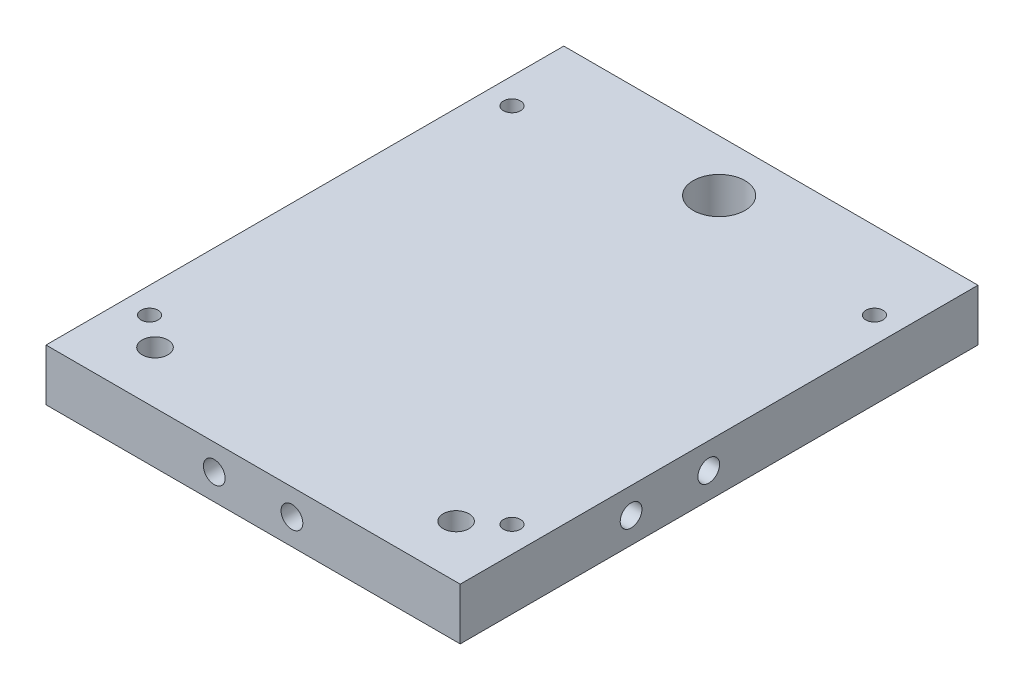
ISO-10303-21;
HEADER;
FILE_DESCRIPTION(('STEP AP214'),'2;1');
FILE_NAME('part.step','',(''),(''),'','','');
FILE_SCHEMA(('AUTOMOTIVE_DESIGN { 1 0 10303 214 1 1 1 1 }'));
ENDSEC;
DATA;
#1=APPLICATION_CONTEXT('core data for automotive mechanical design processes');
#2=APPLICATION_PROTOCOL_DEFINITION('international standard','automotive_design',2000,#1);
#3=PRODUCT_CONTEXT('',#1,'mechanical');
#4=PRODUCT('Part','Part','',(#3));
#5=PRODUCT_RELATED_PRODUCT_CATEGORY('part','',(#4));
#6=PRODUCT_DEFINITION_FORMATION('','',#4);
#7=PRODUCT_DEFINITION_CONTEXT('part definition',#1,'design');
#8=PRODUCT_DEFINITION('design','',#6,#7);
#9=PRODUCT_DEFINITION_SHAPE('','',#8);
#10=(LENGTH_UNIT() NAMED_UNIT(*) SI_UNIT(.MILLI.,.METRE.));
#11=(NAMED_UNIT(*) PLANE_ANGLE_UNIT() SI_UNIT($,.RADIAN.));
#12=(NAMED_UNIT(*) SI_UNIT($,.STERADIAN.) SOLID_ANGLE_UNIT());
#13=UNCERTAINTY_MEASURE_WITH_UNIT(LENGTH_MEASURE(1.E-05),#10,'distance_accuracy_value','');
#14=(GEOMETRIC_REPRESENTATION_CONTEXT(3) GLOBAL_UNCERTAINTY_ASSIGNED_CONTEXT((#13)) GLOBAL_UNIT_ASSIGNED_CONTEXT((#10,
#11,#12)) REPRESENTATION_CONTEXT('',''));
#15=CARTESIAN_POINT('',(0.,0.,0.));
#16=DIRECTION('',(0.,0.,1.));
#17=DIRECTION('',(1.,0.,0.));
#18=AXIS2_PLACEMENT_3D('',#15,#16,#17);
#19=CARTESIAN_POINT('',(0.,10.,0.));
#20=DIRECTION('',(0.,-1.,0.));
#21=DIRECTION('',(0.,0.,-1.));
#22=AXIS2_PLACEMENT_3D('',#19,#20,#21);
#23=PLANE('',#22);
#24=CARTESIAN_POINT('',(-29.0717121826819,10.,39.8738727668022));
#25=DIRECTION('',(0.,1.,0.));
#26=DIRECTION('',(0.,0.,1.));
#27=AXIS2_PLACEMENT_3D('',#24,#25,#26);
#28=CIRCLE('',#27,2.49999999999999);
#29=CARTESIAN_POINT('',(-29.0717121826819,10.,42.3738727668022));
#30=VERTEX_POINT('',#29);
#31=EDGE_CURVE('E152',#30,#30,#28,.T.);
#32=ORIENTED_EDGE('',*,*,#31,.F.);
#33=EDGE_LOOP('',(#32));
#34=FACE_BOUND('',#33,.T.);
#35=DIRECTION('',(0.,0.,-1.));
#36=VECTOR('',#35,1.);
#37=CARTESIAN_POINT('',(40.,10.,50.));
#38=LINE('',#37,#36);
#39=CARTESIAN_POINT('',(40.,10.,50.));
#40=VERTEX_POINT('',#39);
#41=CARTESIAN_POINT('',(40.,10.,-50.));
#42=VERTEX_POINT('',#41);
#43=EDGE_CURVE('E195',#40,#42,#38,.T.);
#44=ORIENTED_EDGE('',*,*,#43,.T.);
#45=DIRECTION('',(-1.,0.,0.));
#46=VECTOR('',#45,1.);
#47=CARTESIAN_POINT('',(-40.,10.,-50.));
#48=LINE('',#47,#46);
#49=CARTESIAN_POINT('',(-40.,10.,-50.));
#50=VERTEX_POINT('',#49);
#51=EDGE_CURVE('E88',#42,#50,#48,.T.);
#52=ORIENTED_EDGE('',*,*,#51,.T.);
#53=DIRECTION('',(0.,0.,1.));
#54=VECTOR('',#53,1.);
#55=CARTESIAN_POINT('',(-40.,10.,50.));
#56=LINE('',#55,#54);
#57=CARTESIAN_POINT('',(-40.,10.,50.));
#58=VERTEX_POINT('',#57);
#59=EDGE_CURVE('E198',#50,#58,#56,.T.);
#60=ORIENTED_EDGE('',*,*,#59,.T.);
#61=DIRECTION('',(1.,0.,0.));
#62=VECTOR('',#61,1.);
#63=CARTESIAN_POINT('',(-40.,10.,50.));
#64=LINE('',#63,#62);
#65=EDGE_CURVE('E57',#58,#40,#64,.T.);
#66=ORIENTED_EDGE('',*,*,#65,.T.);
#67=EDGE_LOOP('',(#44,#52,#60,#66));
#68=FACE_BOUND('',#67,.T.);
#69=CARTESIAN_POINT('',(0.,10.,-40.));
#70=DIRECTION('',(0.,1.,0.));
#71=DIRECTION('',(0.,0.,1.));
#72=AXIS2_PLACEMENT_3D('',#69,#70,#71);
#73=CIRCLE('',#72,5.00000000000001);
#74=CARTESIAN_POINT('',(0.,10.,-35.));
#75=VERTEX_POINT('',#74);
#76=EDGE_CURVE('E188',#75,#75,#73,.T.);
#77=ORIENTED_EDGE('',*,*,#76,.F.);
#78=EDGE_LOOP('',(#77));
#79=FACE_BOUND('',#78,.T.);
#80=CARTESIAN_POINT('',(-35.,10.,-35.));
#81=DIRECTION('',(0.,-1.,0.));
#82=DIRECTION('',(0.,0.,-1.));
#83=AXIS2_PLACEMENT_3D('',#80,#81,#82);
#84=CIRCLE('',#83,1.65);
#85=CARTESIAN_POINT('',(-35.,10.,-36.65));
#86=VERTEX_POINT('',#85);
#87=EDGE_CURVE('E185',#86,#86,#84,.T.);
#88=ORIENTED_EDGE('',*,*,#87,.T.);
#89=EDGE_LOOP('',(#88));
#90=FACE_BOUND('',#89,.T.);
#91=CARTESIAN_POINT('',(35.,10.,-35.));
#92=DIRECTION('',(0.,-1.,0.));
#93=DIRECTION('',(0.,0.,-1.));
#94=AXIS2_PLACEMENT_3D('',#91,#92,#93);
#95=CIRCLE('',#94,1.65);
#96=CARTESIAN_POINT('',(35.,10.,-36.65));
#97=VERTEX_POINT('',#96);
#98=EDGE_CURVE('E179',#97,#97,#95,.T.);
#99=ORIENTED_EDGE('',*,*,#98,.T.);
#100=EDGE_LOOP('',(#99));
#101=FACE_BOUND('',#100,.T.);
#102=CARTESIAN_POINT('',(35.,10.,35.));
#103=DIRECTION('',(0.,-1.,0.));
#104=DIRECTION('',(0.,0.,-1.));
#105=AXIS2_PLACEMENT_3D('',#102,#103,#104);
#106=CIRCLE('',#105,1.65);
#107=CARTESIAN_POINT('',(35.,10.,33.35));
#108=VERTEX_POINT('',#107);
#109=EDGE_CURVE('E173',#108,#108,#106,.T.);
#110=ORIENTED_EDGE('',*,*,#109,.T.);
#111=EDGE_LOOP('',(#110));
#112=FACE_BOUND('',#111,.T.);
#113=CARTESIAN_POINT('',(-35.,10.,35.));
#114=DIRECTION('',(0.,-1.,0.));
#115=DIRECTION('',(0.,0.,-1.));
#116=AXIS2_PLACEMENT_3D('',#113,#114,#115);
#117=CIRCLE('',#116,1.65);
#118=CARTESIAN_POINT('',(-35.,10.,33.35));
#119=VERTEX_POINT('',#118);
#120=EDGE_CURVE('E167',#119,#119,#117,.T.);
#121=ORIENTED_EDGE('',*,*,#120,.T.);
#122=EDGE_LOOP('',(#121));
#123=FACE_BOUND('',#122,.T.);
#124=CARTESIAN_POINT('',(29.0717121826819,10.,39.8738727668022));
#125=DIRECTION('',(0.,1.,0.));
#126=DIRECTION('',(0.,0.,1.));
#127=AXIS2_PLACEMENT_3D('',#124,#125,#126);
#128=CIRCLE('',#127,2.49999999999999);
#129=CARTESIAN_POINT('',(29.0717121826819,10.,42.3738727668022));
#130=VERTEX_POINT('',#129);
#131=EDGE_CURVE('E158',#130,#130,#128,.T.);
#132=ORIENTED_EDGE('',*,*,#131,.F.);
#133=EDGE_LOOP('',(#132));
#134=FACE_BOUND('',#133,.T.);
#135=ADVANCED_FACE('F40',(#34,#68,#79,#90,#101,#112,#123,#134),#23,.F.);
#136=CARTESIAN_POINT('',(40.,10.,50.));
#137=DIRECTION('',(-1.,0.,0.));
#138=DIRECTION('',(0.,0.,1.));
#139=AXIS2_PLACEMENT_3D('',#136,#137,#138);
#140=PLANE('',#139);
#141=CARTESIAN_POINT('',(40.,5.,17.));
#142=DIRECTION('',(1.,0.,0.));
#143=DIRECTION('',(0.,0.,-1.));
#144=AXIS2_PLACEMENT_3D('',#141,#142,#143);
#145=CIRCLE('',#144,2.09999999999999);
#146=CARTESIAN_POINT('',(40.,5.,14.9));
#147=VERTEX_POINT('',#146);
#148=EDGE_CURVE('E140',#147,#147,#145,.T.);
#149=ORIENTED_EDGE('',*,*,#148,.F.);
#150=EDGE_LOOP('',(#149));
#151=FACE_BOUND('',#150,.T.);
#152=CARTESIAN_POINT('',(40.,5.,1.99999999999999));
#153=DIRECTION('',(1.,0.,0.));
#154=DIRECTION('',(0.,0.,-1.));
#155=AXIS2_PLACEMENT_3D('',#152,#153,#154);
#156=CIRCLE('',#155,2.09999999999999);
#157=CARTESIAN_POINT('',(40.,5.,-0.0999999999999942));
#158=VERTEX_POINT('',#157);
#159=EDGE_CURVE('E146',#158,#158,#156,.T.);
#160=ORIENTED_EDGE('',*,*,#159,.F.);
#161=EDGE_LOOP('',(#160));
#162=FACE_BOUND('',#161,.T.);
#163=DIRECTION('',(0.,0.,-1.));
#164=VECTOR('',#163,1.);
#165=CARTESIAN_POINT('',(40.,0.,50.));
#166=LINE('',#165,#164);
#167=CARTESIAN_POINT('',(40.,0.,50.));
#168=VERTEX_POINT('',#167);
#169=CARTESIAN_POINT('',(40.,0.,-50.));
#170=VERTEX_POINT('',#169);
#171=EDGE_CURVE('E194',#168,#170,#166,.T.);
#172=ORIENTED_EDGE('',*,*,#171,.T.);
#173=DIRECTION('',(0.,-1.,0.));
#174=VECTOR('',#173,1.);
#175=CARTESIAN_POINT('',(40.,10.,-50.));
#176=LINE('',#175,#174);
#177=EDGE_CURVE('E11',#42,#170,#176,.T.);
#178=ORIENTED_EDGE('',*,*,#177,.F.);
#179=ORIENTED_EDGE('',*,*,#43,.F.);
#180=DIRECTION('',(0.,-1.,0.));
#181=VECTOR('',#180,1.);
#182=CARTESIAN_POINT('',(40.,10.,50.));
#183=LINE('',#182,#181);
#184=EDGE_CURVE('E201',#40,#168,#183,.T.);
#185=ORIENTED_EDGE('',*,*,#184,.T.);
#186=EDGE_LOOP('',(#172,#178,#179,#185));
#187=FACE_BOUND('',#186,.T.);
#188=ADVANCED_FACE('F42',(#151,#162,#187),#140,.F.);
#189=CARTESIAN_POINT('',(-40.,10.,-50.));
#190=DIRECTION('',(0.,0.,1.));
#191=DIRECTION('',(1.,0.,0.));
#192=AXIS2_PLACEMENT_3D('',#189,#190,#191);
#193=PLANE('',#192);
#194=DIRECTION('',(-1.,0.,0.));
#195=VECTOR('',#194,1.);
#196=CARTESIAN_POINT('',(-40.,0.,-50.));
#197=LINE('',#196,#195);
#198=CARTESIAN_POINT('',(-40.,0.,-50.));
#199=VERTEX_POINT('',#198);
#200=EDGE_CURVE('E204',#170,#199,#197,.T.);
#201=ORIENTED_EDGE('',*,*,#200,.T.);
#202=DIRECTION('',(0.,-1.,0.));
#203=VECTOR('',#202,1.);
#204=CARTESIAN_POINT('',(-40.,10.,-50.));
#205=LINE('',#204,#203);
#206=EDGE_CURVE('E49',#50,#199,#205,.T.);
#207=ORIENTED_EDGE('',*,*,#206,.F.);
#208=ORIENTED_EDGE('',*,*,#51,.F.);
#209=ORIENTED_EDGE('',*,*,#177,.T.);
#210=EDGE_LOOP('',(#201,#207,#208,#209));
#211=FACE_BOUND('',#210,.T.);
#212=ADVANCED_FACE('F230',(#211),#193,.F.);
#213=CARTESIAN_POINT('',(-40.,10.,50.));
#214=DIRECTION('',(1.,0.,0.));
#215=DIRECTION('',(0.,0.,-1.));
#216=AXIS2_PLACEMENT_3D('',#213,#214,#215);
#217=PLANE('',#216);
#218=CARTESIAN_POINT('',(-40.,5.,5.));
#219=DIRECTION('',(-1.,0.,0.));
#220=DIRECTION('',(0.,0.,1.));
#221=AXIS2_PLACEMENT_3D('',#218,#219,#220);
#222=CIRCLE('',#221,2.09999999999999);
#223=CARTESIAN_POINT('',(-40.,5.,7.09999999999999));
#224=VERTEX_POINT('',#223);
#225=EDGE_CURVE('E128',#224,#224,#222,.T.);
#226=ORIENTED_EDGE('',*,*,#225,.F.);
#227=EDGE_LOOP('',(#226));
#228=FACE_BOUND('',#227,.T.);
#229=CARTESIAN_POINT('',(-40.,5.,-8.));
#230=DIRECTION('',(-1.,0.,0.));
#231=DIRECTION('',(0.,0.,1.));
#232=AXIS2_PLACEMENT_3D('',#229,#230,#231);
#233=CIRCLE('',#232,2.09999999999999);
#234=CARTESIAN_POINT('',(-40.,5.,-5.90000000000001));
#235=VERTEX_POINT('',#234);
#236=EDGE_CURVE('E134',#235,#235,#233,.T.);
#237=ORIENTED_EDGE('',*,*,#236,.F.);
#238=EDGE_LOOP('',(#237));
#239=FACE_BOUND('',#238,.T.);
#240=DIRECTION('',(0.,0.,1.));
#241=VECTOR('',#240,1.);
#242=CARTESIAN_POINT('',(-40.,0.,50.));
#243=LINE('',#242,#241);
#244=CARTESIAN_POINT('',(-40.,0.,50.));
#245=VERTEX_POINT('',#244);
#246=EDGE_CURVE('E75',#199,#245,#243,.T.);
#247=ORIENTED_EDGE('',*,*,#246,.T.);
#248=DIRECTION('',(0.,-1.,0.));
#249=VECTOR('',#248,1.);
#250=CARTESIAN_POINT('',(-40.,10.,50.));
#251=LINE('',#250,#249);
#252=EDGE_CURVE('E210',#58,#245,#251,.T.);
#253=ORIENTED_EDGE('',*,*,#252,.F.);
#254=ORIENTED_EDGE('',*,*,#59,.F.);
#255=ORIENTED_EDGE('',*,*,#206,.T.);
#256=EDGE_LOOP('',(#247,#253,#254,#255));
#257=FACE_BOUND('',#256,.T.);
#258=ADVANCED_FACE('F212',(#228,#239,#257),#217,.F.);
#259=CARTESIAN_POINT('',(-40.,10.,50.));
#260=DIRECTION('',(0.,0.,-1.));
#261=DIRECTION('',(-1.,0.,0.));
#262=AXIS2_PLACEMENT_3D('',#259,#260,#261);
#263=PLANE('',#262);
#264=CARTESIAN_POINT('',(-7.5,5.,50.));
#265=DIRECTION('',(0.,0.,1.));
#266=DIRECTION('',(1.,0.,0.));
#267=AXIS2_PLACEMENT_3D('',#264,#265,#266);
#268=CIRCLE('',#267,2.09999999999999);
#269=CARTESIAN_POINT('',(-5.40000000000001,5.,50.));
#270=VERTEX_POINT('',#269);
#271=EDGE_CURVE('E118',#270,#270,#268,.T.);
#272=ORIENTED_EDGE('',*,*,#271,.F.);
#273=EDGE_LOOP('',(#272));
#274=FACE_BOUND('',#273,.T.);
#275=CARTESIAN_POINT('',(7.5,5.,50.));
#276=DIRECTION('',(0.,0.,1.));
#277=DIRECTION('',(1.,0.,0.));
#278=AXIS2_PLACEMENT_3D('',#275,#276,#277);
#279=CIRCLE('',#278,2.09999999999999);
#280=CARTESIAN_POINT('',(9.59999999999999,5.,50.));
#281=VERTEX_POINT('',#280);
#282=EDGE_CURVE('E117',#281,#281,#279,.T.);
#283=ORIENTED_EDGE('',*,*,#282,.F.);
#284=EDGE_LOOP('',(#283));
#285=FACE_BOUND('',#284,.T.);
#286=DIRECTION('',(1.,0.,0.));
#287=VECTOR('',#286,1.);
#288=CARTESIAN_POINT('',(-40.,0.,50.));
#289=LINE('',#288,#287);
#290=EDGE_CURVE('E81',#245,#168,#289,.T.);
#291=ORIENTED_EDGE('',*,*,#290,.T.);
#292=ORIENTED_EDGE('',*,*,#184,.F.);
#293=ORIENTED_EDGE('',*,*,#65,.F.);
#294=ORIENTED_EDGE('',*,*,#252,.T.);
#295=EDGE_LOOP('',(#291,#292,#293,#294));
#296=FACE_BOUND('',#295,.T.);
#297=ADVANCED_FACE('F219',(#274,#285,#296),#263,.F.);
#298=CARTESIAN_POINT('',(0.,0.,0.));
#299=DIRECTION('',(0.,-1.,0.));
#300=DIRECTION('',(0.,0.,-1.));
#301=AXIS2_PLACEMENT_3D('',#298,#299,#300);
#302=PLANE('',#301);
#303=CARTESIAN_POINT('',(-29.0717121826819,0.,39.8738727668022));
#304=DIRECTION('',(0.,1.,0.));
#305=DIRECTION('',(0.,0.,1.));
#306=AXIS2_PLACEMENT_3D('',#303,#304,#305);
#307=CIRCLE('',#306,2.5);
#308=CARTESIAN_POINT('',(-29.0717121826819,0.,42.3738727668022));
#309=VERTEX_POINT('',#308);
#310=EDGE_CURVE('E155',#309,#309,#307,.T.);
#311=ORIENTED_EDGE('',*,*,#310,.T.);
#312=EDGE_LOOP('',(#311));
#313=FACE_BOUND('',#312,.T.);
#314=CARTESIAN_POINT('',(29.0717121826819,0.,39.8738727668022));
#315=DIRECTION('',(0.,1.,0.));
#316=DIRECTION('',(0.,0.,1.));
#317=AXIS2_PLACEMENT_3D('',#314,#315,#316);
#318=CIRCLE('',#317,2.5);
#319=CARTESIAN_POINT('',(29.0717121826819,0.,42.3738727668022));
#320=VERTEX_POINT('',#319);
#321=EDGE_CURVE('E161',#320,#320,#318,.T.);
#322=ORIENTED_EDGE('',*,*,#321,.T.);
#323=EDGE_LOOP('',(#322));
#324=FACE_BOUND('',#323,.T.);
#325=CARTESIAN_POINT('',(-35.,0.,35.));
#326=DIRECTION('',(0.,-1.,0.));
#327=DIRECTION('',(0.,0.,-1.));
#328=AXIS2_PLACEMENT_3D('',#325,#326,#327);
#329=CIRCLE('',#328,1.64999999999998);
#330=CARTESIAN_POINT('',(-35.,0.,33.35));
#331=VERTEX_POINT('',#330);
#332=EDGE_CURVE('E164',#331,#331,#329,.T.);
#333=ORIENTED_EDGE('',*,*,#332,.F.);
#334=EDGE_LOOP('',(#333));
#335=FACE_BOUND('',#334,.T.);
#336=CARTESIAN_POINT('',(35.,0.,35.));
#337=DIRECTION('',(0.,-1.,0.));
#338=DIRECTION('',(0.,0.,-1.));
#339=AXIS2_PLACEMENT_3D('',#336,#337,#338);
#340=CIRCLE('',#339,1.64999999999998);
#341=CARTESIAN_POINT('',(35.,0.,33.35));
#342=VERTEX_POINT('',#341);
#343=EDGE_CURVE('E170',#342,#342,#340,.T.);
#344=ORIENTED_EDGE('',*,*,#343,.F.);
#345=EDGE_LOOP('',(#344));
#346=FACE_BOUND('',#345,.T.);
#347=CARTESIAN_POINT('',(35.,0.,-35.));
#348=DIRECTION('',(0.,-1.,0.));
#349=DIRECTION('',(0.,0.,-1.));
#350=AXIS2_PLACEMENT_3D('',#347,#348,#349);
#351=CIRCLE('',#350,1.64999999999998);
#352=CARTESIAN_POINT('',(35.,0.,-36.65));
#353=VERTEX_POINT('',#352);
#354=EDGE_CURVE('E176',#353,#353,#351,.T.);
#355=ORIENTED_EDGE('',*,*,#354,.F.);
#356=EDGE_LOOP('',(#355));
#357=FACE_BOUND('',#356,.T.);
#358=CARTESIAN_POINT('',(-35.,0.,-35.));
#359=DIRECTION('',(0.,-1.,0.));
#360=DIRECTION('',(0.,0.,-1.));
#361=AXIS2_PLACEMENT_3D('',#358,#359,#360);
#362=CIRCLE('',#361,1.64999999999998);
#363=CARTESIAN_POINT('',(-35.,0.,-36.65));
#364=VERTEX_POINT('',#363);
#365=EDGE_CURVE('E182',#364,#364,#362,.T.);
#366=ORIENTED_EDGE('',*,*,#365,.F.);
#367=EDGE_LOOP('',(#366));
#368=FACE_BOUND('',#367,.T.);
#369=CARTESIAN_POINT('',(0.,0.,-40.));
#370=DIRECTION('',(0.,1.,0.));
#371=DIRECTION('',(0.,0.,1.));
#372=AXIS2_PLACEMENT_3D('',#369,#370,#371);
#373=CIRCLE('',#372,5.00000000000001);
#374=CARTESIAN_POINT('',(0.,0.,-35.));
#375=VERTEX_POINT('',#374);
#376=EDGE_CURVE('E191',#375,#375,#373,.T.);
#377=ORIENTED_EDGE('',*,*,#376,.T.);
#378=EDGE_LOOP('',(#377));
#379=FACE_BOUND('',#378,.T.);
#380=ORIENTED_EDGE('',*,*,#171,.F.);
#381=ORIENTED_EDGE('',*,*,#290,.F.);
#382=ORIENTED_EDGE('',*,*,#246,.F.);
#383=ORIENTED_EDGE('',*,*,#200,.F.);
#384=EDGE_LOOP('',(#380,#381,#382,#383));
#385=FACE_BOUND('',#384,.T.);
#386=ADVANCED_FACE('F215',(#313,#324,#335,#346,#357,#368,#379,#385),#302,.T.);
#387=CARTESIAN_POINT('',(0.,10.,-40.));
#388=DIRECTION('',(0.,1.,0.));
#389=DIRECTION('',(0.,0.,1.));
#390=AXIS2_PLACEMENT_3D('',#387,#388,#389);
#391=CYLINDRICAL_SURFACE('',#390,5.00000000000001);
#392=ORIENTED_EDGE('',*,*,#376,.F.);
#393=EDGE_LOOP('',(#392));
#394=FACE_BOUND('',#393,.T.);
#395=ORIENTED_EDGE('',*,*,#76,.T.);
#396=EDGE_LOOP('',(#395));
#397=FACE_BOUND('',#396,.T.);
#398=ADVANCED_FACE('F227',(#394,#397),#391,.F.);
#399=CARTESIAN_POINT('',(-35.,0.,-35.));
#400=DIRECTION('',(0.,-1.,0.));
#401=DIRECTION('',(0.,0.,-1.));
#402=AXIS2_PLACEMENT_3D('',#399,#400,#401);
#403=CYLINDRICAL_SURFACE('',#402,1.64999999999999);
#404=ORIENTED_EDGE('',*,*,#87,.F.);
#405=EDGE_LOOP('',(#404));
#406=FACE_BOUND('',#405,.T.);
#407=ORIENTED_EDGE('',*,*,#365,.T.);
#408=EDGE_LOOP('',(#407));
#409=FACE_BOUND('',#408,.T.);
#410=ADVANCED_FACE('F246',(#406,#409),#403,.F.);
#411=CARTESIAN_POINT('',(35.,0.,-35.));
#412=DIRECTION('',(0.,-1.,0.));
#413=DIRECTION('',(0.,0.,-1.));
#414=AXIS2_PLACEMENT_3D('',#411,#412,#413);
#415=CYLINDRICAL_SURFACE('',#414,1.64999999999999);
#416=ORIENTED_EDGE('',*,*,#98,.F.);
#417=EDGE_LOOP('',(#416));
#418=FACE_BOUND('',#417,.T.);
#419=ORIENTED_EDGE('',*,*,#354,.T.);
#420=EDGE_LOOP('',(#419));
#421=FACE_BOUND('',#420,.T.);
#422=ADVANCED_FACE('F250',(#418,#421),#415,.F.);
#423=CARTESIAN_POINT('',(35.,0.,35.));
#424=DIRECTION('',(0.,-1.,0.));
#425=DIRECTION('',(0.,0.,-1.));
#426=AXIS2_PLACEMENT_3D('',#423,#424,#425);
#427=CYLINDRICAL_SURFACE('',#426,1.64999999999999);
#428=ORIENTED_EDGE('',*,*,#109,.F.);
#429=EDGE_LOOP('',(#428));
#430=FACE_BOUND('',#429,.T.);
#431=ORIENTED_EDGE('',*,*,#343,.T.);
#432=EDGE_LOOP('',(#431));
#433=FACE_BOUND('',#432,.T.);
#434=ADVANCED_FACE('F254',(#430,#433),#427,.F.);
#435=CARTESIAN_POINT('',(-35.,0.,35.));
#436=DIRECTION('',(0.,-1.,0.));
#437=DIRECTION('',(0.,0.,-1.));
#438=AXIS2_PLACEMENT_3D('',#435,#436,#437);
#439=CYLINDRICAL_SURFACE('',#438,1.64999999999999);
#440=ORIENTED_EDGE('',*,*,#120,.F.);
#441=EDGE_LOOP('',(#440));
#442=FACE_BOUND('',#441,.T.);
#443=ORIENTED_EDGE('',*,*,#332,.T.);
#444=EDGE_LOOP('',(#443));
#445=FACE_BOUND('',#444,.T.);
#446=ADVANCED_FACE('F258',(#442,#445),#439,.F.);
#447=CARTESIAN_POINT('',(29.0717121826819,10.,39.8738727668022));
#448=DIRECTION('',(0.,1.,0.));
#449=DIRECTION('',(0.,0.,1.));
#450=AXIS2_PLACEMENT_3D('',#447,#448,#449);
#451=CYLINDRICAL_SURFACE('',#450,2.5);
#452=ORIENTED_EDGE('',*,*,#321,.F.);
#453=EDGE_LOOP('',(#452));
#454=FACE_BOUND('',#453,.T.);
#455=ORIENTED_EDGE('',*,*,#131,.T.);
#456=EDGE_LOOP('',(#455));
#457=FACE_BOUND('',#456,.T.);
#458=ADVANCED_FACE('F262',(#454,#457),#451,.F.);
#459=CARTESIAN_POINT('',(-29.0717121826819,10.,39.8738727668022));
#460=DIRECTION('',(0.,1.,0.));
#461=DIRECTION('',(0.,0.,1.));
#462=AXIS2_PLACEMENT_3D('',#459,#460,#461);
#463=CYLINDRICAL_SURFACE('',#462,2.49999999999999);
#464=ORIENTED_EDGE('',*,*,#310,.F.);
#465=EDGE_LOOP('',(#464));
#466=FACE_BOUND('',#465,.T.);
#467=ORIENTED_EDGE('',*,*,#31,.T.);
#468=EDGE_LOOP('',(#467));
#469=FACE_BOUND('',#468,.T.);
#470=ADVANCED_FACE('F266',(#466,#469),#463,.F.);
#471=CARTESIAN_POINT('',(27.6,5.,1.99999999999999));
#472=DIRECTION('',(1.,0.,0.));
#473=DIRECTION('',(0.,0.,-1.));
#474=AXIS2_PLACEMENT_3D('',#471,#472,#473);
#475=CONICAL_SURFACE('',#474,2.09999999999999,1.02974425867665);
#476=CARTESIAN_POINT('',(26.3381927000421,5.,1.99999999999999));
#477=VERTEX_POINT('',#476);
#478=VERTEX_LOOP('',#477);
#479=FACE_BOUND('',#478,.T.);
#480=CARTESIAN_POINT('',(27.6,5.,1.99999999999999));
#481=DIRECTION('',(1.,0.,0.));
#482=DIRECTION('',(0.,0.,-1.));
#483=AXIS2_PLACEMENT_3D('',#480,#481,#482);
#484=CIRCLE('',#483,2.09999999999999);
#485=CARTESIAN_POINT('',(27.6,5.,-0.0999999999999925));
#486=VERTEX_POINT('',#485);
#487=EDGE_CURVE('E149',#486,#486,#484,.T.);
#488=ORIENTED_EDGE('',*,*,#487,.T.);
#489=EDGE_LOOP('',(#488));
#490=FACE_BOUND('',#489,.T.);
#491=ADVANCED_FACE('F270',(#479,#490),#475,.F.);
#492=CARTESIAN_POINT('',(40.,5.,1.99999999999999));
#493=DIRECTION('',(1.,0.,0.));
#494=DIRECTION('',(0.,0.,-1.));
#495=AXIS2_PLACEMENT_3D('',#492,#493,#494);
#496=CYLINDRICAL_SURFACE('',#495,2.09999999999999);
#497=ORIENTED_EDGE('',*,*,#487,.F.);
#498=EDGE_LOOP('',(#497));
#499=FACE_BOUND('',#498,.T.);
#500=ORIENTED_EDGE('',*,*,#159,.T.);
#501=EDGE_LOOP('',(#500));
#502=FACE_BOUND('',#501,.T.);
#503=ADVANCED_FACE('F274',(#499,#502),#496,.F.);
#504=CARTESIAN_POINT('',(27.6,5.,17.));
#505=DIRECTION('',(1.,0.,0.));
#506=DIRECTION('',(0.,0.,-1.));
#507=AXIS2_PLACEMENT_3D('',#504,#505,#506);
#508=CONICAL_SURFACE('',#507,2.09999999999999,1.02974425867665);
#509=CARTESIAN_POINT('',(26.3381927000421,5.,17.));
#510=VERTEX_POINT('',#509);
#511=VERTEX_LOOP('',#510);
#512=FACE_BOUND('',#511,.T.);
#513=CARTESIAN_POINT('',(27.6,5.,17.));
#514=DIRECTION('',(1.,0.,0.));
#515=DIRECTION('',(0.,0.,-1.));
#516=AXIS2_PLACEMENT_3D('',#513,#514,#515);
#517=CIRCLE('',#516,2.09999999999999);
#518=CARTESIAN_POINT('',(27.6,5.,14.9));
#519=VERTEX_POINT('',#518);
#520=EDGE_CURVE('E143',#519,#519,#517,.T.);
#521=ORIENTED_EDGE('',*,*,#520,.T.);
#522=EDGE_LOOP('',(#521));
#523=FACE_BOUND('',#522,.T.);
#524=ADVANCED_FACE('F278',(#512,#523),#508,.F.);
#525=CARTESIAN_POINT('',(40.,5.,17.));
#526=DIRECTION('',(1.,0.,0.));
#527=DIRECTION('',(0.,0.,-1.));
#528=AXIS2_PLACEMENT_3D('',#525,#526,#527);
#529=CYLINDRICAL_SURFACE('',#528,2.09999999999999);
#530=ORIENTED_EDGE('',*,*,#520,.F.);
#531=EDGE_LOOP('',(#530));
#532=FACE_BOUND('',#531,.T.);
#533=ORIENTED_EDGE('',*,*,#148,.T.);
#534=EDGE_LOOP('',(#533));
#535=FACE_BOUND('',#534,.T.);
#536=ADVANCED_FACE('F282',(#532,#535),#529,.F.);
#537=CARTESIAN_POINT('',(-27.6,5.,-8.));
#538=DIRECTION('',(-1.,0.,0.));
#539=DIRECTION('',(0.,0.,1.));
#540=AXIS2_PLACEMENT_3D('',#537,#538,#539);
#541=CONICAL_SURFACE('',#540,2.09999999999999,1.02974425867665);
#542=CARTESIAN_POINT('',(-26.3381927000421,5.,-8.));
#543=VERTEX_POINT('',#542);
#544=VERTEX_LOOP('',#543);
#545=FACE_BOUND('',#544,.T.);
#546=CARTESIAN_POINT('',(-27.6,5.,-8.));
#547=DIRECTION('',(-1.,0.,0.));
#548=DIRECTION('',(0.,0.,1.));
#549=AXIS2_PLACEMENT_3D('',#546,#547,#548);
#550=CIRCLE('',#549,2.09999999999999);
#551=CARTESIAN_POINT('',(-27.6,5.,-5.90000000000001));
#552=VERTEX_POINT('',#551);
#553=EDGE_CURVE('E137',#552,#552,#550,.T.);
#554=ORIENTED_EDGE('',*,*,#553,.T.);
#555=EDGE_LOOP('',(#554));
#556=FACE_BOUND('',#555,.T.);
#557=ADVANCED_FACE('F286',(#545,#556),#541,.F.);
#558=CARTESIAN_POINT('',(-40.,5.,-8.));
#559=DIRECTION('',(-1.,0.,0.));
#560=DIRECTION('',(0.,0.,1.));
#561=AXIS2_PLACEMENT_3D('',#558,#559,#560);
#562=CYLINDRICAL_SURFACE('',#561,2.09999999999999);
#563=ORIENTED_EDGE('',*,*,#553,.F.);
#564=EDGE_LOOP('',(#563));
#565=FACE_BOUND('',#564,.T.);
#566=ORIENTED_EDGE('',*,*,#236,.T.);
#567=EDGE_LOOP('',(#566));
#568=FACE_BOUND('',#567,.T.);
#569=ADVANCED_FACE('F290',(#565,#568),#562,.F.);
#570=CARTESIAN_POINT('',(-27.6,5.,5.));
#571=DIRECTION('',(-1.,0.,0.));
#572=DIRECTION('',(0.,0.,1.));
#573=AXIS2_PLACEMENT_3D('',#570,#571,#572);
#574=CONICAL_SURFACE('',#573,2.09999999999999,1.02974425867665);
#575=CARTESIAN_POINT('',(-26.3381927000421,5.,5.));
#576=VERTEX_POINT('',#575);
#577=VERTEX_LOOP('',#576);
#578=FACE_BOUND('',#577,.T.);
#579=CARTESIAN_POINT('',(-27.6,5.,5.));
#580=DIRECTION('',(-1.,0.,0.));
#581=DIRECTION('',(0.,0.,1.));
#582=AXIS2_PLACEMENT_3D('',#579,#580,#581);
#583=CIRCLE('',#582,2.09999999999999);
#584=CARTESIAN_POINT('',(-27.6,5.,7.09999999999998));
#585=VERTEX_POINT('',#584);
#586=EDGE_CURVE('E131',#585,#585,#583,.T.);
#587=ORIENTED_EDGE('',*,*,#586,.T.);
#588=EDGE_LOOP('',(#587));
#589=FACE_BOUND('',#588,.T.);
#590=ADVANCED_FACE('F294',(#578,#589),#574,.F.);
#591=CARTESIAN_POINT('',(-40.,5.,5.));
#592=DIRECTION('',(-1.,0.,0.));
#593=DIRECTION('',(0.,0.,1.));
#594=AXIS2_PLACEMENT_3D('',#591,#592,#593);
#595=CYLINDRICAL_SURFACE('',#594,2.09999999999999);
#596=ORIENTED_EDGE('',*,*,#586,.F.);
#597=EDGE_LOOP('',(#596));
#598=FACE_BOUND('',#597,.T.);
#599=ORIENTED_EDGE('',*,*,#225,.T.);
#600=EDGE_LOOP('',(#599));
#601=FACE_BOUND('',#600,.T.);
#602=ADVANCED_FACE('F298',(#598,#601),#595,.F.);
#603=CARTESIAN_POINT('',(7.5,5.,39.6));
#604=DIRECTION('',(0.,0.,1.));
#605=DIRECTION('',(1.,0.,0.));
#606=AXIS2_PLACEMENT_3D('',#603,#604,#605);
#607=CONICAL_SURFACE('',#606,2.09999999999999,1.02974425867665);
#608=CARTESIAN_POINT('',(7.49999999999999,5.,38.3381927000421));
#609=VERTEX_POINT('',#608);
#610=VERTEX_LOOP('',#609);
#611=FACE_BOUND('',#610,.T.);
#612=CARTESIAN_POINT('',(7.5,5.,39.6));
#613=DIRECTION('',(0.,0.,1.));
#614=DIRECTION('',(1.,0.,0.));
#615=AXIS2_PLACEMENT_3D('',#612,#613,#614);
#616=CIRCLE('',#615,2.09999999999999);
#617=CARTESIAN_POINT('',(9.59999999999999,5.,39.6));
#618=VERTEX_POINT('',#617);
#619=EDGE_CURVE('E121',#618,#618,#616,.T.);
#620=ORIENTED_EDGE('',*,*,#619,.T.);
#621=EDGE_LOOP('',(#620));
#622=FACE_BOUND('',#621,.T.);
#623=ADVANCED_FACE('F302',(#611,#622),#607,.F.);
#624=CARTESIAN_POINT('',(7.5,5.,50.));
#625=DIRECTION('',(0.,0.,1.));
#626=DIRECTION('',(1.,0.,0.));
#627=AXIS2_PLACEMENT_3D('',#624,#625,#626);
#628=CYLINDRICAL_SURFACE('',#627,2.09999999999999);
#629=ORIENTED_EDGE('',*,*,#619,.F.);
#630=EDGE_LOOP('',(#629));
#631=FACE_BOUND('',#630,.T.);
#632=ORIENTED_EDGE('',*,*,#282,.T.);
#633=EDGE_LOOP('',(#632));
#634=FACE_BOUND('',#633,.T.);
#635=ADVANCED_FACE('F111',(#631,#634),#628,.F.);
#636=CARTESIAN_POINT('',(-7.5,5.,39.6));
#637=DIRECTION('',(0.,0.,1.));
#638=DIRECTION('',(1.,0.,0.));
#639=AXIS2_PLACEMENT_3D('',#636,#637,#638);
#640=CONICAL_SURFACE('',#639,2.09999999999999,1.02974425867665);
#641=CARTESIAN_POINT('',(-7.50000000000001,5.,38.3381927000421));
#642=VERTEX_POINT('',#641);
#643=VERTEX_LOOP('',#642);
#644=FACE_BOUND('',#643,.T.);
#645=CARTESIAN_POINT('',(-7.5,5.,39.6));
#646=DIRECTION('',(0.,0.,1.));
#647=DIRECTION('',(1.,0.,0.));
#648=AXIS2_PLACEMENT_3D('',#645,#646,#647);
#649=CIRCLE('',#648,2.09999999999999);
#650=CARTESIAN_POINT('',(-5.40000000000001,5.,39.6));
#651=VERTEX_POINT('',#650);
#652=EDGE_CURVE('E115',#651,#651,#649,.T.);
#653=ORIENTED_EDGE('',*,*,#652,.T.);
#654=EDGE_LOOP('',(#653));
#655=FACE_BOUND('',#654,.T.);
#656=ADVANCED_FACE('F107',(#644,#655),#640,.F.);
#657=CARTESIAN_POINT('',(-7.5,5.,50.));
#658=DIRECTION('',(0.,0.,1.));
#659=DIRECTION('',(1.,0.,0.));
#660=AXIS2_PLACEMENT_3D('',#657,#658,#659);
#661=CYLINDRICAL_SURFACE('',#660,2.09999999999999);
#662=ORIENTED_EDGE('',*,*,#652,.F.);
#663=EDGE_LOOP('',(#662));
#664=FACE_BOUND('',#663,.T.);
#665=ORIENTED_EDGE('',*,*,#271,.T.);
#666=EDGE_LOOP('',(#665));
#667=FACE_BOUND('',#666,.T.);
#668=ADVANCED_FACE('F110',(#664,#667),#661,.F.);
#669=CLOSED_SHELL('',(#135,#188,#212,#258,#297,#386,#398,#410,#422,#434,#446,#458,#470,#491,
#503,#524,#536,#557,#569,#590,#602,#623,#635,#656,#668));
#670=MANIFOLD_SOLID_BREP('B2',#669);
#671=ADVANCED_BREP_SHAPE_REPRESENTATION('',(#18,#670),#14);
#672=SHAPE_DEFINITION_REPRESENTATION(#9,#671);
ENDSEC;
END-ISO-10303-21;
